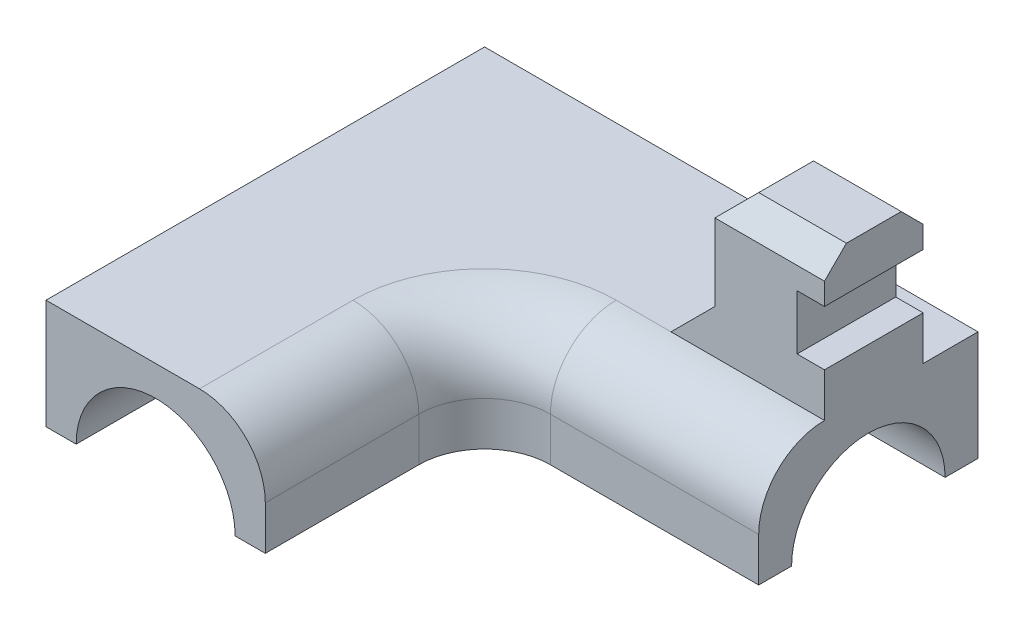
ISO-10303-21;
HEADER;
FILE_DESCRIPTION(('STEP AP214'),'2;1');
FILE_NAME('part.step','',(''),(''),'','','');
FILE_SCHEMA(('AUTOMOTIVE_DESIGN { 1 0 10303 214 1 1 1 1 }'));
ENDSEC;
DATA;
#1=APPLICATION_CONTEXT('core data for automotive mechanical design processes');
#2=APPLICATION_PROTOCOL_DEFINITION('international standard','automotive_design',2000,#1);
#3=PRODUCT_CONTEXT('',#1,'mechanical');
#4=PRODUCT('Part','Part','',(#3));
#5=PRODUCT_RELATED_PRODUCT_CATEGORY('part','',(#4));
#6=PRODUCT_DEFINITION_FORMATION('','',#4);
#7=PRODUCT_DEFINITION_CONTEXT('part definition',#1,'design');
#8=PRODUCT_DEFINITION('design','',#6,#7);
#9=PRODUCT_DEFINITION_SHAPE('','',#8);
#10=(LENGTH_UNIT() NAMED_UNIT(*) SI_UNIT(.MILLI.,.METRE.));
#11=(NAMED_UNIT(*) PLANE_ANGLE_UNIT() SI_UNIT($,.RADIAN.));
#12=(NAMED_UNIT(*) SI_UNIT($,.STERADIAN.) SOLID_ANGLE_UNIT());
#13=UNCERTAINTY_MEASURE_WITH_UNIT(LENGTH_MEASURE(1.E-05),#10,'distance_accuracy_value','');
#14=(GEOMETRIC_REPRESENTATION_CONTEXT(3) GLOBAL_UNCERTAINTY_ASSIGNED_CONTEXT((#13)) GLOBAL_UNIT_ASSIGNED_CONTEXT((#10,
#11,#12)) REPRESENTATION_CONTEXT('',''));
#15=CARTESIAN_POINT('',(0.,0.,0.));
#16=DIRECTION('',(0.,0.,1.));
#17=DIRECTION('',(1.,0.,0.));
#18=AXIS2_PLACEMENT_3D('',#15,#16,#17);
#19=CARTESIAN_POINT('',(0.,0.,0.));
#20=DIRECTION('',(0.,1.,0.));
#21=DIRECTION('',(0.,0.,1.));
#22=AXIS2_PLACEMENT_3D('',#19,#20,#21);
#23=PLANE('',#22);
#24=DIRECTION('',(0.,0.,1.));
#25=VECTOR('',#24,1.);
#26=CARTESIAN_POINT('',(15.,0.,10.));
#27=LINE('',#26,#25);
#28=CARTESIAN_POINT('',(15.,0.,16.));
#29=VERTEX_POINT('',#28);
#30=CARTESIAN_POINT('',(15.,0.,17.));
#31=VERTEX_POINT('',#30);
#32=EDGE_CURVE('E425',#29,#31,#27,.T.);
#33=ORIENTED_EDGE('',*,*,#32,.T.);
#34=DIRECTION('',(1.,0.,0.));
#35=VECTOR('',#34,1.);
#36=CARTESIAN_POINT('',(15.,0.,17.));
#37=LINE('',#36,#35);
#38=CARTESIAN_POINT('',(35.,0.,17.));
#39=VERTEX_POINT('',#38);
#40=EDGE_CURVE('E446',#39,#31,#37,.F.);
#41=ORIENTED_EDGE('',*,*,#40,.F.);
#42=DIRECTION('',(0.,0.,1.));
#43=VECTOR('',#42,1.);
#44=CARTESIAN_POINT('',(35.,0.,0.));
#45=LINE('',#44,#43);
#46=CARTESIAN_POINT('',(35.,0.,20.));
#47=VERTEX_POINT('',#46);
#48=EDGE_CURVE('E447',#39,#47,#45,.T.);
#49=ORIENTED_EDGE('',*,*,#48,.T.);
#50=DIRECTION('',(1.,0.,0.));
#51=VECTOR('',#50,1.);
#52=CARTESIAN_POINT('',(35.,0.,20.));
#53=LINE('',#52,#51);
#54=CARTESIAN_POINT('',(16.,0.,20.));
#55=VERTEX_POINT('',#54);
#56=EDGE_CURVE('E443',#55,#47,#53,.T.);
#57=ORIENTED_EDGE('',*,*,#56,.F.);
#58=CARTESIAN_POINT('',(16.,0.,26.));
#59=DIRECTION('',(0.,1.,0.));
#60=DIRECTION('',(0.,0.,1.));
#61=AXIS2_PLACEMENT_3D('',#58,#59,#60);
#62=CIRCLE('',#61,6.);
#63=CARTESIAN_POINT('',(10.,0.,26.));
#64=VERTEX_POINT('',#63);
#65=EDGE_CURVE('E422',#64,#55,#62,.F.);
#66=ORIENTED_EDGE('',*,*,#65,.F.);
#67=DIRECTION('',(0.,0.,-1.));
#68=VECTOR('',#67,1.);
#69=CARTESIAN_POINT('',(10.,0.,40.));
#70=LINE('',#69,#68);
#71=CARTESIAN_POINT('',(10.,0.,40.));
#72=VERTEX_POINT('',#71);
#73=EDGE_CURVE('E432',#72,#64,#70,.T.);
#74=ORIENTED_EDGE('',*,*,#73,.F.);
#75=DIRECTION('',(-1.,0.,0.));
#76=VECTOR('',#75,1.);
#77=CARTESIAN_POINT('',(0.,0.,40.));
#78=LINE('',#77,#76);
#79=CARTESIAN_POINT('',(7.25,0.,40.));
#80=VERTEX_POINT('',#79);
#81=EDGE_CURVE('E453',#72,#80,#78,.T.);
#82=ORIENTED_EDGE('',*,*,#81,.T.);
#83=DIRECTION('',(0.,0.,1.));
#84=VECTOR('',#83,1.);
#85=CARTESIAN_POINT('',(7.25,0.,20.));
#86=LINE('',#85,#84);
#87=CARTESIAN_POINT('',(7.25,0.,20.));
#88=VERTEX_POINT('',#87);
#89=EDGE_CURVE('E460',#88,#80,#86,.T.);
#90=ORIENTED_EDGE('',*,*,#89,.F.);
#91=DIRECTION('',(-1.,0.,0.));
#92=VECTOR('',#91,1.);
#93=CARTESIAN_POINT('',(0.,0.,20.));
#94=LINE('',#93,#92);
#95=CARTESIAN_POINT('',(6.,0.,20.));
#96=VERTEX_POINT('',#95);
#97=EDGE_CURVE('E429',#88,#96,#94,.T.);
#98=ORIENTED_EDGE('',*,*,#97,.T.);
#99=DIRECTION('',(0.,0.,1.));
#100=VECTOR('',#99,1.);
#101=CARTESIAN_POINT('',(6.,0.,-0.001000000000001));
#102=LINE('',#101,#100);
#103=CARTESIAN_POINT('',(6.,0.,16.));
#104=VERTEX_POINT('',#103);
#105=EDGE_CURVE('E41',#104,#96,#102,.T.);
#106=ORIENTED_EDGE('',*,*,#105,.F.);
#107=DIRECTION('',(1.,0.,0.));
#108=VECTOR('',#107,1.);
#109=CARTESIAN_POINT('',(-26.9705627484772,0.,16.));
#110=LINE('',#109,#108);
#111=EDGE_CURVE('E451',#29,#104,#110,.F.);
#112=ORIENTED_EDGE('',*,*,#111,.F.);
#113=EDGE_LOOP('',(#33,#41,#49,#57,#66,#74,#82,#90,#98,#106,#112));
#114=FACE_BOUND('',#113,.T.);
#115=ADVANCED_FACE('F37',(#114),#23,.F.);
#116=CARTESIAN_POINT('',(-6.,0.,20.));
#117=VERTEX_POINT('',#116);
#118=CARTESIAN_POINT('',(-7.25,0.,20.));
#119=VERTEX_POINT('',#118);
#120=EDGE_CURVE('E461',#117,#119,#94,.T.);
#121=ORIENTED_EDGE('',*,*,#120,.T.);
#122=DIRECTION('',(0.,0.,1.));
#123=VECTOR('',#122,1.);
#124=CARTESIAN_POINT('',(-7.25,0.,20.));
#125=LINE('',#124,#123);
#126=CARTESIAN_POINT('',(-7.25,0.,40.));
#127=VERTEX_POINT('',#126);
#128=EDGE_CURVE('E458',#127,#119,#125,.F.);
#129=ORIENTED_EDGE('',*,*,#128,.F.);
#130=CARTESIAN_POINT('',(-10.,0.,40.));
#131=VERTEX_POINT('',#130);
#132=EDGE_CURVE('E454',#127,#131,#78,.T.);
#133=ORIENTED_EDGE('',*,*,#132,.T.);
#134=DIRECTION('',(0.,0.,1.));
#135=VECTOR('',#134,1.);
#136=CARTESIAN_POINT('',(-10.,0.,40.));
#137=LINE('',#136,#135);
#138=CARTESIAN_POINT('',(-10.,0.,14.));
#139=VERTEX_POINT('',#138);
#140=EDGE_CURVE('E433',#139,#131,#137,.T.);
#141=ORIENTED_EDGE('',*,*,#140,.F.);
#142=CARTESIAN_POINT('',(-10.,0.,15.));
#143=DIRECTION('',(0.,1.,0.));
#144=DIRECTION('',(0.,0.,1.));
#145=AXIS2_PLACEMENT_3D('',#142,#143,#144);
#146=CIRCLE('',#145,1.);
#147=CARTESIAN_POINT('',(-9.,0.,15.));
#148=VERTEX_POINT('',#147);
#149=EDGE_CURVE('E46',#139,#148,#146,.F.);
#150=ORIENTED_EDGE('',*,*,#149,.T.);
#151=DIRECTION('',(0.,0.,1.));
#152=VECTOR('',#151,1.);
#153=CARTESIAN_POINT('',(-9.,0.,40.));
#154=LINE('',#153,#152);
#155=CARTESIAN_POINT('',(-9.,0.,16.));
#156=VERTEX_POINT('',#155);
#157=EDGE_CURVE('E426',#148,#156,#154,.T.);
#158=ORIENTED_EDGE('',*,*,#157,.T.);
#159=CARTESIAN_POINT('',(-6.,0.,16.));
#160=VERTEX_POINT('',#159);
#161=EDGE_CURVE('E436',#160,#156,#110,.F.);
#162=ORIENTED_EDGE('',*,*,#161,.F.);
#163=DIRECTION('',(0.,0.,1.));
#164=VECTOR('',#163,1.);
#165=CARTESIAN_POINT('',(-6.,0.,-0.001000000000001));
#166=LINE('',#165,#164);
#167=EDGE_CURVE('E437',#117,#160,#166,.F.);
#168=ORIENTED_EDGE('',*,*,#167,.F.);
#169=EDGE_LOOP('',(#121,#129,#133,#141,#150,#158,#162,#168));
#170=FACE_BOUND('',#169,.T.);
#171=ADVANCED_FACE('F483',(#170),#23,.F.);
#172=CARTESIAN_POINT('',(35.,0.,0.));
#173=VERTEX_POINT('',#172);
#174=CARTESIAN_POINT('',(35.,0.,3.));
#175=VERTEX_POINT('',#174);
#176=EDGE_CURVE('E450',#173,#175,#45,.T.);
#177=ORIENTED_EDGE('',*,*,#176,.T.);
#178=DIRECTION('',(1.,0.,0.));
#179=VECTOR('',#178,1.);
#180=CARTESIAN_POINT('',(15.,0.,3.));
#181=LINE('',#180,#179);
#182=CARTESIAN_POINT('',(15.,0.,3.));
#183=VERTEX_POINT('',#182);
#184=EDGE_CURVE('E444',#183,#175,#181,.T.);
#185=ORIENTED_EDGE('',*,*,#184,.F.);
#186=CARTESIAN_POINT('',(15.,0.,4.));
#187=VERTEX_POINT('',#186);
#188=EDGE_CURVE('E440',#183,#187,#27,.T.);
#189=ORIENTED_EDGE('',*,*,#188,.T.);
#190=DIRECTION('',(1.,0.,0.));
#191=VECTOR('',#190,1.);
#192=CARTESIAN_POINT('',(-26.9705627484772,0.,4.));
#193=LINE('',#192,#191);
#194=CARTESIAN_POINT('',(-9.,0.,4.));
#195=VERTEX_POINT('',#194);
#196=EDGE_CURVE('E434',#195,#187,#193,.T.);
#197=ORIENTED_EDGE('',*,*,#196,.F.);
#198=CARTESIAN_POINT('',(-9.,0.,5.));
#199=VERTEX_POINT('',#198);
#200=EDGE_CURVE('E430',#195,#199,#154,.T.);
#201=ORIENTED_EDGE('',*,*,#200,.T.);
#202=CARTESIAN_POINT('',(-10.,0.,5.));
#203=DIRECTION('',(0.,1.,0.));
#204=DIRECTION('',(0.,0.,1.));
#205=AXIS2_PLACEMENT_3D('',#202,#203,#204);
#206=CIRCLE('',#205,1.);
#207=CARTESIAN_POINT('',(-10.,0.,6.));
#208=VERTEX_POINT('',#207);
#209=EDGE_CURVE('E12',#199,#208,#206,.F.);
#210=ORIENTED_EDGE('',*,*,#209,.T.);
#211=CARTESIAN_POINT('',(-10.,0.,0.));
#212=VERTEX_POINT('',#211);
#213=EDGE_CURVE('E61',#212,#208,#137,.T.);
#214=ORIENTED_EDGE('',*,*,#213,.F.);
#215=DIRECTION('',(-1.,0.,0.));
#216=VECTOR('',#215,1.);
#217=CARTESIAN_POINT('',(0.,0.,0.));
#218=LINE('',#217,#216);
#219=EDGE_CURVE('E441',#173,#212,#218,.T.);
#220=ORIENTED_EDGE('',*,*,#219,.F.);
#221=EDGE_LOOP('',(#177,#185,#189,#197,#201,#210,#214,#220));
#222=FACE_BOUND('',#221,.T.);
#223=ADVANCED_FACE('F39',(#222),#23,.F.);
#224=CARTESIAN_POINT('',(-10.,10.,40.));
#225=DIRECTION('',(0.,-1.,0.));
#226=DIRECTION('',(0.,0.,-1.));
#227=AXIS2_PLACEMENT_3D('',#224,#225,#226);
#228=PLANE('',#227);
#229=DIRECTION('',(-1.,0.,0.));
#230=VECTOR('',#229,1.);
#231=CARTESIAN_POINT('',(-10.,10.,40.));
#232=LINE('',#231,#230);
#233=CARTESIAN_POINT('',(4.,10.,40.));
#234=VERTEX_POINT('',#233);
#235=CARTESIAN_POINT('',(-10.,10.,40.));
#236=VERTEX_POINT('',#235);
#237=EDGE_CURVE('E360',#234,#236,#232,.T.);
#238=ORIENTED_EDGE('',*,*,#237,.F.);
#239=DIRECTION('',(0.,0.,-1.));
#240=VECTOR('',#239,1.);
#241=CARTESIAN_POINT('',(4.,10.,40.));
#242=LINE('',#241,#240);
#243=CARTESIAN_POINT('',(4.,10.,26.));
#244=VERTEX_POINT('',#243);
#245=EDGE_CURVE('E408',#234,#244,#242,.T.);
#246=ORIENTED_EDGE('',*,*,#245,.T.);
#247=CARTESIAN_POINT('',(16.,10.,26.));
#248=DIRECTION('',(0.,-1.,0.));
#249=DIRECTION('',(0.,0.,-1.));
#250=AXIS2_PLACEMENT_3D('',#247,#248,#249);
#251=CIRCLE('',#250,12.);
#252=CARTESIAN_POINT('',(16.,10.,14.));
#253=VERTEX_POINT('',#252);
#254=EDGE_CURVE('E245',#253,#244,#251,.F.);
#255=ORIENTED_EDGE('',*,*,#254,.F.);
#256=DIRECTION('',(-1.,0.,0.));
#257=VECTOR('',#256,1.);
#258=CARTESIAN_POINT('',(-10.,10.,14.));
#259=LINE('',#258,#257);
#260=CARTESIAN_POINT('',(20.9999999999999,10.,14.));
#261=VERTEX_POINT('',#260);
#262=EDGE_CURVE('E238',#253,#261,#259,.F.);
#263=ORIENTED_EDGE('',*,*,#262,.T.);
#264=DIRECTION('',(0.,0.,-1.));
#265=VECTOR('',#264,1.);
#266=CARTESIAN_POINT('',(20.9999999999999,10.,14.));
#267=LINE('',#266,#265);
#268=CARTESIAN_POINT('',(20.9999999999999,10.,5.));
#269=VERTEX_POINT('',#268);
#270=EDGE_CURVE('E243',#261,#269,#267,.T.);
#271=ORIENTED_EDGE('',*,*,#270,.T.);
#272=DIRECTION('',(-1.,0.,0.));
#273=VECTOR('',#272,1.);
#274=CARTESIAN_POINT('',(20.9999999999999,10.,5.));
#275=LINE('',#274,#273);
#276=CARTESIAN_POINT('',(35.,10.,5.));
#277=VERTEX_POINT('',#276);
#278=EDGE_CURVE('E295',#277,#269,#275,.T.);
#279=ORIENTED_EDGE('',*,*,#278,.F.);
#280=DIRECTION('',(0.,0.,1.));
#281=VECTOR('',#280,1.);
#282=CARTESIAN_POINT('',(35.,10.,20.));
#283=LINE('',#282,#281);
#284=CARTESIAN_POINT('',(35.,10.,0.));
#285=VERTEX_POINT('',#284);
#286=EDGE_CURVE('E351',#285,#277,#283,.T.);
#287=ORIENTED_EDGE('',*,*,#286,.F.);
#288=DIRECTION('',(-1.,0.,0.));
#289=VECTOR('',#288,1.);
#290=CARTESIAN_POINT('',(-10.,10.,0.));
#291=LINE('',#290,#289);
#292=CARTESIAN_POINT('',(-10.,10.,0.));
#293=VERTEX_POINT('',#292);
#294=EDGE_CURVE('E357',#285,#293,#291,.T.);
#295=ORIENTED_EDGE('',*,*,#294,.T.);
#296=DIRECTION('',(0.,0.,-1.));
#297=VECTOR('',#296,1.);
#298=CARTESIAN_POINT('',(-10.,10.,40.));
#299=LINE('',#298,#297);
#300=EDGE_CURVE('E366',#236,#293,#299,.T.);
#301=ORIENTED_EDGE('',*,*,#300,.F.);
#302=EDGE_LOOP('',(#238,#246,#255,#263,#271,#279,#287,#295,#301));
#303=FACE_BOUND('',#302,.T.);
#304=ADVANCED_FACE('F241',(#303),#228,.F.);
#305=CARTESIAN_POINT('',(-26.9705627484772,0.,10.));
#306=DIRECTION('',(1.,0.,0.));
#307=DIRECTION('',(0.,1.,0.));
#308=AXIS2_PLACEMENT_3D('',#305,#306,#307);
#309=CYLINDRICAL_SURFACE('',#308,6.);
#310=CARTESIAN_POINT('',(15.,0.,10.));
#311=DIRECTION('',(1.,0.,0.));
#312=DIRECTION('',(0.,1.,0.));
#313=AXIS2_PLACEMENT_3D('',#310,#311,#312);
#314=CIRCLE('',#313,6.);
#315=EDGE_CURVE('E331',#29,#187,#314,.F.);
#316=ORIENTED_EDGE('',*,*,#315,.F.);
#317=ORIENTED_EDGE('',*,*,#111,.T.);
#318=CARTESIAN_POINT('',(0.,0.,10.));
#319=DIRECTION('',(-0.707106781186547,0.,0.707106781186548));
#320=DIRECTION('',(0.707106781186547,0.,0.707106781186548));
#321=AXIS2_PLACEMENT_3D('',#318,#319,#320);
#322=ELLIPSE('',#321,8.48528137423857,6.);
#323=CARTESIAN_POINT('',(0.,6.,10.));
#324=VERTEX_POINT('',#323);
#325=EDGE_CURVE('E344',#324,#104,#322,.F.);
#326=ORIENTED_EDGE('',*,*,#325,.F.);
#327=CARTESIAN_POINT('',(0.,0.,10.));
#328=DIRECTION('',(0.707106781186547,0.,0.707106781186548));
#329=DIRECTION('',(-0.707106781186547,0.,0.707106781186548));
#330=AXIS2_PLACEMENT_3D('',#327,#328,#329);
#331=ELLIPSE('',#330,8.48528137423857,6.);
#332=EDGE_CURVE('E341',#160,#324,#331,.F.);
#333=ORIENTED_EDGE('',*,*,#332,.F.);
#334=ORIENTED_EDGE('',*,*,#161,.T.);
#335=CARTESIAN_POINT('',(-9.,0.,10.));
#336=DIRECTION('',(1.,0.,0.));
#337=DIRECTION('',(0.,1.,0.));
#338=AXIS2_PLACEMENT_3D('',#335,#336,#337);
#339=CIRCLE('',#338,6.);
#340=EDGE_CURVE('E343',#156,#195,#339,.F.);
#341=ORIENTED_EDGE('',*,*,#340,.T.);
#342=ORIENTED_EDGE('',*,*,#196,.T.);
#343=EDGE_LOOP('',(#316,#317,#326,#333,#334,#341,#342));
#344=FACE_BOUND('',#343,.T.);
#345=ADVANCED_FACE('F497',(#344),#309,.F.);
#346=CARTESIAN_POINT('',(0.,0.,-0.001000000000001));
#347=DIRECTION('',(0.,0.,1.));
#348=DIRECTION('',(1.,0.,0.));
#349=AXIS2_PLACEMENT_3D('',#346,#347,#348);
#350=CYLINDRICAL_SURFACE('',#349,6.);
#351=CARTESIAN_POINT('',(0.,0.,20.));
#352=DIRECTION('',(0.,0.,1.));
#353=DIRECTION('',(1.,0.,0.));
#354=AXIS2_PLACEMENT_3D('',#351,#352,#353);
#355=CIRCLE('',#354,6.);
#356=EDGE_CURVE('E337',#117,#96,#355,.F.);
#357=ORIENTED_EDGE('',*,*,#356,.F.);
#358=ORIENTED_EDGE('',*,*,#167,.T.);
#359=ORIENTED_EDGE('',*,*,#332,.T.);
#360=ORIENTED_EDGE('',*,*,#325,.T.);
#361=ORIENTED_EDGE('',*,*,#105,.T.);
#362=EDGE_LOOP('',(#357,#358,#359,#360,#361));
#363=FACE_BOUND('',#362,.T.);
#364=ADVANCED_FACE('F493',(#363),#350,.F.);
#365=CARTESIAN_POINT('',(10.,10.,40.));
#366=DIRECTION('',(-1.,0.,0.));
#367=DIRECTION('',(0.,-1.,0.));
#368=AXIS2_PLACEMENT_3D('',#365,#366,#367);
#369=PLANE('',#368);
#370=DIRECTION('',(0.,1.,0.));
#371=VECTOR('',#370,1.);
#372=CARTESIAN_POINT('',(10.,10.,40.));
#373=LINE('',#372,#371);
#374=CARTESIAN_POINT('',(10.,4.,40.));
#375=VERTEX_POINT('',#374);
#376=EDGE_CURVE('E358',#72,#375,#373,.T.);
#377=ORIENTED_EDGE('',*,*,#376,.F.);
#378=ORIENTED_EDGE('',*,*,#73,.T.);
#379=DIRECTION('',(0.,-1.,0.));
#380=VECTOR('',#379,1.);
#381=CARTESIAN_POINT('',(10.,9.99999999999999,26.));
#382=LINE('',#381,#380);
#383=CARTESIAN_POINT('',(10.,4.,26.));
#384=VERTEX_POINT('',#383);
#385=EDGE_CURVE('E403',#64,#384,#382,.F.);
#386=ORIENTED_EDGE('',*,*,#385,.T.);
#387=DIRECTION('',(0.,0.,-1.));
#388=VECTOR('',#387,1.);
#389=CARTESIAN_POINT('',(10.,4.,40.));
#390=LINE('',#389,#388);
#391=EDGE_CURVE('E250',#384,#375,#390,.F.);
#392=ORIENTED_EDGE('',*,*,#391,.T.);
#393=EDGE_LOOP('',(#377,#378,#386,#392));
#394=FACE_BOUND('',#393,.T.);
#395=ADVANCED_FACE('F527',(#394),#369,.F.);
#396=CARTESIAN_POINT('',(-10.,10.,40.));
#397=DIRECTION('',(1.,0.,0.));
#398=DIRECTION('',(0.,1.,0.));
#399=AXIS2_PLACEMENT_3D('',#396,#397,#398);
#400=PLANE('',#399);
#401=DIRECTION('',(0.,-1.,0.));
#402=VECTOR('',#401,1.);
#403=CARTESIAN_POINT('',(-10.,10.,0.));
#404=LINE('',#403,#402);
#405=EDGE_CURVE('E361',#293,#212,#404,.T.);
#406=ORIENTED_EDGE('',*,*,#405,.T.);
#407=ORIENTED_EDGE('',*,*,#213,.T.);
#408=CARTESIAN_POINT('',(-10.,0.,10.));
#409=DIRECTION('',(-1.,0.,0.));
#410=DIRECTION('',(0.,-1.,0.));
#411=AXIS2_PLACEMENT_3D('',#408,#409,#410);
#412=CIRCLE('',#411,4.);
#413=EDGE_CURVE('E314',#139,#208,#412,.T.);
#414=ORIENTED_EDGE('',*,*,#413,.F.);
#415=ORIENTED_EDGE('',*,*,#140,.T.);
#416=DIRECTION('',(0.,-1.,0.));
#417=VECTOR('',#416,1.);
#418=CARTESIAN_POINT('',(-10.,10.,40.));
#419=LINE('',#418,#417);
#420=EDGE_CURVE('E363',#236,#131,#419,.T.);
#421=ORIENTED_EDGE('',*,*,#420,.F.);
#422=ORIENTED_EDGE('',*,*,#300,.T.);
#423=EDGE_LOOP('',(#406,#407,#414,#415,#421,#422));
#424=FACE_BOUND('',#423,.T.);
#425=ADVANCED_FACE('F536',(#424),#400,.F.);
#426=CARTESIAN_POINT('',(0.,0.,40.));
#427=DIRECTION('',(0.,0.,1.));
#428=DIRECTION('',(1.,0.,0.));
#429=AXIS2_PLACEMENT_3D('',#426,#427,#428);
#430=PLANE('',#429);
#431=ORIENTED_EDGE('',*,*,#81,.F.);
#432=ORIENTED_EDGE('',*,*,#376,.T.);
#433=CARTESIAN_POINT('',(4.,4.,40.));
#434=DIRECTION('',(0.,0.,1.));
#435=DIRECTION('',(1.,0.,0.));
#436=AXIS2_PLACEMENT_3D('',#433,#434,#435);
#437=CIRCLE('',#436,6.);
#438=EDGE_CURVE('E410',#375,#234,#437,.T.);
#439=ORIENTED_EDGE('',*,*,#438,.T.);
#440=ORIENTED_EDGE('',*,*,#237,.T.);
#441=ORIENTED_EDGE('',*,*,#420,.T.);
#442=ORIENTED_EDGE('',*,*,#132,.F.);
#443=CARTESIAN_POINT('',(0.,0.,40.));
#444=DIRECTION('',(0.,0.,1.));
#445=DIRECTION('',(1.,0.,0.));
#446=AXIS2_PLACEMENT_3D('',#443,#444,#445);
#447=CIRCLE('',#446,7.25);
#448=EDGE_CURVE('E338',#80,#127,#447,.T.);
#449=ORIENTED_EDGE('',*,*,#448,.F.);
#450=EDGE_LOOP('',(#431,#432,#439,#440,#441,#442,#449));
#451=FACE_BOUND('',#450,.T.);
#452=ADVANCED_FACE('F479',(#451),#430,.T.);
#453=CARTESIAN_POINT('',(0.,0.,0.));
#454=DIRECTION('',(0.,0.,1.));
#455=DIRECTION('',(1.,0.,0.));
#456=AXIS2_PLACEMENT_3D('',#453,#454,#455);
#457=PLANE('',#456);
#458=DIRECTION('',(0.,1.,0.));
#459=VECTOR('',#458,1.);
#460=CARTESIAN_POINT('',(35.,10.,0.));
#461=LINE('',#460,#459);
#462=EDGE_CURVE('E349',#173,#285,#461,.T.);
#463=ORIENTED_EDGE('',*,*,#462,.F.);
#464=ORIENTED_EDGE('',*,*,#219,.T.);
#465=ORIENTED_EDGE('',*,*,#405,.F.);
#466=ORIENTED_EDGE('',*,*,#294,.F.);
#467=EDGE_LOOP('',(#463,#464,#465,#466));
#468=FACE_BOUND('',#467,.T.);
#469=ADVANCED_FACE('F544',(#468),#457,.F.);
#470=CARTESIAN_POINT('',(35.,10.,20.));
#471=DIRECTION('',(0.,0.,-1.));
#472=DIRECTION('',(0.,1.,0.));
#473=AXIS2_PLACEMENT_3D('',#470,#471,#472);
#474=PLANE('',#473);
#475=DIRECTION('',(0.,-1.,0.));
#476=VECTOR('',#475,1.);
#477=CARTESIAN_POINT('',(16.,-10.,20.));
#478=LINE('',#477,#476);
#479=CARTESIAN_POINT('',(16.,4.,20.));
#480=VERTEX_POINT('',#479);
#481=EDGE_CURVE('E400',#480,#55,#478,.T.);
#482=ORIENTED_EDGE('',*,*,#481,.T.);
#483=ORIENTED_EDGE('',*,*,#56,.T.);
#484=DIRECTION('',(0.,-1.,0.));
#485=VECTOR('',#484,1.);
#486=CARTESIAN_POINT('',(35.,10.,20.));
#487=LINE('',#486,#485);
#488=CARTESIAN_POINT('',(35.,4.,20.));
#489=VERTEX_POINT('',#488);
#490=EDGE_CURVE('E354',#489,#47,#487,.T.);
#491=ORIENTED_EDGE('',*,*,#490,.F.);
#492=DIRECTION('',(-1.,0.,0.));
#493=VECTOR('',#492,1.);
#494=CARTESIAN_POINT('',(35.,4.,20.));
#495=LINE('',#494,#493);
#496=EDGE_CURVE('E392',#489,#480,#495,.T.);
#497=ORIENTED_EDGE('',*,*,#496,.T.);
#498=EDGE_LOOP('',(#482,#483,#491,#497));
#499=FACE_BOUND('',#498,.T.);
#500=ADVANCED_FACE('F516',(#499),#474,.F.);
#501=CARTESIAN_POINT('',(35.,0.,0.));
#502=DIRECTION('',(1.,0.,0.));
#503=DIRECTION('',(0.,1.,0.));
#504=AXIS2_PLACEMENT_3D('',#501,#502,#503);
#505=PLANE('',#504);
#506=ORIENTED_EDGE('',*,*,#176,.F.);
#507=ORIENTED_EDGE('',*,*,#462,.T.);
#508=ORIENTED_EDGE('',*,*,#286,.T.);
#509=DIRECTION('',(0.,-1.,0.));
#510=VECTOR('',#509,1.);
#511=CARTESIAN_POINT('',(35.,10.,5.));
#512=LINE('',#511,#510);
#513=CARTESIAN_POINT('',(35.,14.,5.));
#514=VERTEX_POINT('',#513);
#515=EDGE_CURVE('E277',#514,#277,#512,.T.);
#516=ORIENTED_EDGE('',*,*,#515,.F.);
#517=DIRECTION('',(0.,0.,-1.));
#518=VECTOR('',#517,1.);
#519=CARTESIAN_POINT('',(35.,14.,14.));
#520=LINE('',#519,#518);
#521=CARTESIAN_POINT('',(35.,14.,14.));
#522=VERTEX_POINT('',#521);
#523=EDGE_CURVE('E312',#522,#514,#520,.T.);
#524=ORIENTED_EDGE('',*,*,#523,.F.);
#525=DIRECTION('',(0.,-1.,0.));
#526=VECTOR('',#525,1.);
#527=CARTESIAN_POINT('',(35.,10.,14.));
#528=LINE('',#527,#526);
#529=CARTESIAN_POINT('',(35.,10.,14.));
#530=VERTEX_POINT('',#529);
#531=EDGE_CURVE('E261',#522,#530,#528,.T.);
#532=ORIENTED_EDGE('',*,*,#531,.T.);
#533=CARTESIAN_POINT('',(35.,4.,14.));
#534=DIRECTION('',(1.,0.,0.));
#535=DIRECTION('',(0.,1.,0.));
#536=AXIS2_PLACEMENT_3D('',#533,#534,#535);
#537=CIRCLE('',#536,6.);
#538=EDGE_CURVE('E276',#530,#489,#537,.T.);
#539=ORIENTED_EDGE('',*,*,#538,.T.);
#540=ORIENTED_EDGE('',*,*,#490,.T.);
#541=ORIENTED_EDGE('',*,*,#48,.F.);
#542=CARTESIAN_POINT('',(35.,0.,10.));
#543=DIRECTION('',(1.,0.,0.));
#544=DIRECTION('',(0.,1.,0.));
#545=AXIS2_PLACEMENT_3D('',#542,#543,#544);
#546=CIRCLE('',#545,7.);
#547=EDGE_CURVE('E327',#175,#39,#546,.T.);
#548=ORIENTED_EDGE('',*,*,#547,.F.);
#549=EDGE_LOOP('',(#506,#507,#508,#516,#524,#532,#539,#540,#541,#548));
#550=FACE_BOUND('',#549,.T.);
#551=ADVANCED_FACE('F512',(#550),#505,.T.);
#552=CARTESIAN_POINT('',(-9.,10.,40.));
#553=DIRECTION('',(1.,0.,0.));
#554=DIRECTION('',(0.,1.,0.));
#555=AXIS2_PLACEMENT_3D('',#552,#553,#554);
#556=PLANE('',#555);
#557=ORIENTED_EDGE('',*,*,#200,.F.);
#558=ORIENTED_EDGE('',*,*,#340,.F.);
#559=ORIENTED_EDGE('',*,*,#157,.F.);
#560=CARTESIAN_POINT('',(-9.,0.,10.));
#561=DIRECTION('',(1.,0.,0.));
#562=DIRECTION('',(0.,1.,0.));
#563=AXIS2_PLACEMENT_3D('',#560,#561,#562);
#564=CIRCLE('',#563,5.);
#565=EDGE_CURVE('E413',#148,#199,#564,.F.);
#566=ORIENTED_EDGE('',*,*,#565,.T.);
#567=EDGE_LOOP('',(#557,#558,#559,#566));
#568=FACE_BOUND('',#567,.T.);
#569=ADVANCED_FACE('F541',(#568),#556,.T.);
#570=CARTESIAN_POINT('',(0.,0.,20.));
#571=DIRECTION('',(0.,0.,1.));
#572=DIRECTION('',(1.,0.,0.));
#573=AXIS2_PLACEMENT_3D('',#570,#571,#572);
#574=PLANE('',#573);
#575=ORIENTED_EDGE('',*,*,#97,.F.);
#576=CARTESIAN_POINT('',(0.,0.,20.));
#577=DIRECTION('',(0.,0.,1.));
#578=DIRECTION('',(1.,0.,0.));
#579=AXIS2_PLACEMENT_3D('',#576,#577,#578);
#580=CIRCLE('',#579,7.25);
#581=EDGE_CURVE('E334',#88,#119,#580,.T.);
#582=ORIENTED_EDGE('',*,*,#581,.T.);
#583=ORIENTED_EDGE('',*,*,#120,.F.);
#584=ORIENTED_EDGE('',*,*,#356,.T.);
#585=EDGE_LOOP('',(#575,#582,#583,#584));
#586=FACE_BOUND('',#585,.T.);
#587=ADVANCED_FACE('F488',(#586),#574,.T.);
#588=CARTESIAN_POINT('',(0.,0.,20.));
#589=DIRECTION('',(0.,0.,1.));
#590=DIRECTION('',(1.,0.,0.));
#591=AXIS2_PLACEMENT_3D('',#588,#589,#590);
#592=CYLINDRICAL_SURFACE('',#591,7.25);
#593=ORIENTED_EDGE('',*,*,#448,.T.);
#594=ORIENTED_EDGE('',*,*,#128,.T.);
#595=ORIENTED_EDGE('',*,*,#581,.F.);
#596=ORIENTED_EDGE('',*,*,#89,.T.);
#597=EDGE_LOOP('',(#593,#594,#595,#596));
#598=FACE_BOUND('',#597,.T.);
#599=ADVANCED_FACE('F471',(#598),#592,.F.);
#600=CARTESIAN_POINT('',(15.,0.,10.));
#601=DIRECTION('',(1.,0.,0.));
#602=DIRECTION('',(0.,1.,0.));
#603=AXIS2_PLACEMENT_3D('',#600,#601,#602);
#604=PLANE('',#603);
#605=ORIENTED_EDGE('',*,*,#188,.F.);
#606=CARTESIAN_POINT('',(15.,0.,10.));
#607=DIRECTION('',(1.,0.,0.));
#608=DIRECTION('',(0.,1.,0.));
#609=AXIS2_PLACEMENT_3D('',#606,#607,#608);
#610=CIRCLE('',#609,7.);
#611=EDGE_CURVE('E328',#183,#31,#610,.T.);
#612=ORIENTED_EDGE('',*,*,#611,.T.);
#613=ORIENTED_EDGE('',*,*,#32,.F.);
#614=ORIENTED_EDGE('',*,*,#315,.T.);
#615=EDGE_LOOP('',(#605,#612,#613,#614));
#616=FACE_BOUND('',#615,.T.);
#617=ADVANCED_FACE('F501',(#616),#604,.T.);
#618=CARTESIAN_POINT('',(15.,0.,10.));
#619=DIRECTION('',(1.,0.,0.));
#620=DIRECTION('',(0.,1.,0.));
#621=AXIS2_PLACEMENT_3D('',#618,#619,#620);
#622=CYLINDRICAL_SURFACE('',#621,7.);
#623=ORIENTED_EDGE('',*,*,#547,.T.);
#624=ORIENTED_EDGE('',*,*,#40,.T.);
#625=ORIENTED_EDGE('',*,*,#611,.F.);
#626=ORIENTED_EDGE('',*,*,#184,.T.);
#627=EDGE_LOOP('',(#623,#624,#625,#626));
#628=FACE_BOUND('',#627,.T.);
#629=ADVANCED_FACE('F508',(#628),#622,.F.);
#630=CARTESIAN_POINT('',(35.,14.,14.));
#631=DIRECTION('',(0.,1.,0.));
#632=DIRECTION('',(0.,0.,1.));
#633=AXIS2_PLACEMENT_3D('',#630,#631,#632);
#634=PLANE('',#633);
#635=DIRECTION('',(1.,0.,0.));
#636=VECTOR('',#635,1.);
#637=CARTESIAN_POINT('',(35.,14.,5.));
#638=LINE('',#637,#636);
#639=CARTESIAN_POINT('',(32.5,14.,5.));
#640=VERTEX_POINT('',#639);
#641=EDGE_CURVE('E279',#640,#514,#638,.T.);
#642=ORIENTED_EDGE('',*,*,#641,.F.);
#643=DIRECTION('',(0.,0.,-1.));
#644=VECTOR('',#643,1.);
#645=CARTESIAN_POINT('',(32.5,14.,14.));
#646=LINE('',#645,#644);
#647=CARTESIAN_POINT('',(32.5,14.,14.));
#648=VERTEX_POINT('',#647);
#649=EDGE_CURVE('E315',#648,#640,#646,.T.);
#650=ORIENTED_EDGE('',*,*,#649,.F.);
#651=DIRECTION('',(1.,0.,0.));
#652=VECTOR('',#651,1.);
#653=CARTESIAN_POINT('',(35.,14.,14.));
#654=LINE('',#653,#652);
#655=EDGE_CURVE('E291',#648,#522,#654,.T.);
#656=ORIENTED_EDGE('',*,*,#655,.T.);
#657=ORIENTED_EDGE('',*,*,#523,.T.);
#658=EDGE_LOOP('',(#642,#650,#656,#657));
#659=FACE_BOUND('',#658,.T.);
#660=ADVANCED_FACE('F551',(#659),#634,.T.);
#661=CARTESIAN_POINT('',(32.5,14.,14.));
#662=DIRECTION('',(1.,0.,0.));
#663=DIRECTION('',(0.,0.,-1.));
#664=AXIS2_PLACEMENT_3D('',#661,#662,#663);
#665=PLANE('',#664);
#666=DIRECTION('',(0.,-1.,0.));
#667=VECTOR('',#666,1.);
#668=CARTESIAN_POINT('',(32.5,14.,5.));
#669=LINE('',#668,#667);
#670=CARTESIAN_POINT('',(32.5,19.,5.));
#671=VERTEX_POINT('',#670);
#672=EDGE_CURVE('E307',#671,#640,#669,.T.);
#673=ORIENTED_EDGE('',*,*,#672,.F.);
#674=DIRECTION('',(0.,0.,-1.));
#675=VECTOR('',#674,1.);
#676=CARTESIAN_POINT('',(32.5,19.,14.));
#677=LINE('',#676,#675);
#678=CARTESIAN_POINT('',(32.5,19.,14.));
#679=VERTEX_POINT('',#678);
#680=EDGE_CURVE('E317',#679,#671,#677,.T.);
#681=ORIENTED_EDGE('',*,*,#680,.F.);
#682=DIRECTION('',(0.,-1.,0.));
#683=VECTOR('',#682,1.);
#684=CARTESIAN_POINT('',(32.5,14.,14.));
#685=LINE('',#684,#683);
#686=EDGE_CURVE('E288',#679,#648,#685,.T.);
#687=ORIENTED_EDGE('',*,*,#686,.T.);
#688=ORIENTED_EDGE('',*,*,#649,.T.);
#689=EDGE_LOOP('',(#673,#681,#687,#688));
#690=FACE_BOUND('',#689,.T.);
#691=ADVANCED_FACE('F556',(#690),#665,.T.);
#692=CARTESIAN_POINT('',(32.5,19.,14.));
#693=DIRECTION('',(0.,-1.,0.));
#694=DIRECTION('',(1.,0.,0.));
#695=AXIS2_PLACEMENT_3D('',#692,#693,#694);
#696=PLANE('',#695);
#697=DIRECTION('',(-1.,0.,0.));
#698=VECTOR('',#697,1.);
#699=CARTESIAN_POINT('',(32.5,19.,5.));
#700=LINE('',#699,#698);
#701=CARTESIAN_POINT('',(35.,19.,5.));
#702=VERTEX_POINT('',#701);
#703=EDGE_CURVE('E304',#702,#671,#700,.T.);
#704=ORIENTED_EDGE('',*,*,#703,.F.);
#705=DIRECTION('',(0.,0.,-1.));
#706=VECTOR('',#705,1.);
#707=CARTESIAN_POINT('',(35.,19.,14.));
#708=LINE('',#707,#706);
#709=CARTESIAN_POINT('',(35.,19.,14.));
#710=VERTEX_POINT('',#709);
#711=EDGE_CURVE('E319',#710,#702,#708,.T.);
#712=ORIENTED_EDGE('',*,*,#711,.F.);
#713=DIRECTION('',(-1.,0.,0.));
#714=VECTOR('',#713,1.);
#715=CARTESIAN_POINT('',(32.5,19.,14.));
#716=LINE('',#715,#714);
#717=EDGE_CURVE('E285',#710,#679,#716,.T.);
#718=ORIENTED_EDGE('',*,*,#717,.T.);
#719=ORIENTED_EDGE('',*,*,#680,.T.);
#720=EDGE_LOOP('',(#704,#712,#718,#719));
#721=FACE_BOUND('',#720,.T.);
#722=ADVANCED_FACE('F559',(#721),#696,.T.);
#723=CARTESIAN_POINT('',(35.,19.,14.));
#724=DIRECTION('',(1.,0.,0.));
#725=DIRECTION('',(0.,0.,-1.));
#726=AXIS2_PLACEMENT_3D('',#723,#724,#725);
#727=PLANE('',#726);
#728=DIRECTION('',(0.,-1.,0.));
#729=VECTOR('',#728,1.);
#730=CARTESIAN_POINT('',(35.,19.,5.));
#731=LINE('',#730,#729);
#732=CARTESIAN_POINT('',(35.,21.,5.));
#733=VERTEX_POINT('',#732);
#734=EDGE_CURVE('E302',#733,#702,#731,.T.);
#735=ORIENTED_EDGE('',*,*,#734,.F.);
#736=DIRECTION('',(0.,0.707106781186546,0.707106781186549));
#737=VECTOR('',#736,1.);
#738=CARTESIAN_POINT('',(35.,24.5,8.50000000000001));
#739=LINE('',#738,#737);
#740=CARTESIAN_POINT('',(35.,23.,7.));
#741=VERTEX_POINT('',#740);
#742=EDGE_CURVE('E380',#733,#741,#739,.T.);
#743=ORIENTED_EDGE('',*,*,#742,.T.);
#744=DIRECTION('',(0.,0.,-1.));
#745=VECTOR('',#744,1.);
#746=CARTESIAN_POINT('',(35.,23.,14.));
#747=LINE('',#746,#745);
#748=CARTESIAN_POINT('',(35.,23.,12.));
#749=VERTEX_POINT('',#748);
#750=EDGE_CURVE('E322',#749,#741,#747,.T.);
#751=ORIENTED_EDGE('',*,*,#750,.F.);
#752=DIRECTION('',(0.,0.707106781186546,-0.707106781186549));
#753=VECTOR('',#752,1.);
#754=CARTESIAN_POINT('',(35.,20.,15.));
#755=LINE('',#754,#753);
#756=CARTESIAN_POINT('',(35.,21.,14.));
#757=VERTEX_POINT('',#756);
#758=EDGE_CURVE('E378',#749,#757,#755,.F.);
#759=ORIENTED_EDGE('',*,*,#758,.T.);
#760=DIRECTION('',(0.,-1.,0.));
#761=VECTOR('',#760,1.);
#762=CARTESIAN_POINT('',(35.,19.,14.));
#763=LINE('',#762,#761);
#764=EDGE_CURVE('E283',#757,#710,#763,.T.);
#765=ORIENTED_EDGE('',*,*,#764,.T.);
#766=ORIENTED_EDGE('',*,*,#711,.T.);
#767=EDGE_LOOP('',(#735,#743,#751,#759,#765,#766));
#768=FACE_BOUND('',#767,.T.);
#769=ADVANCED_FACE('F579',(#768),#727,.T.);
#770=CARTESIAN_POINT('',(35.,23.,14.));
#771=DIRECTION('',(0.,1.,0.));
#772=DIRECTION('',(0.,0.,1.));
#773=AXIS2_PLACEMENT_3D('',#770,#771,#772);
#774=PLANE('',#773);
#775=ORIENTED_EDGE('',*,*,#750,.T.);
#776=DIRECTION('',(-1.,0.,0.));
#777=VECTOR('',#776,1.);
#778=CARTESIAN_POINT('',(25.,23.,7.));
#779=LINE('',#778,#777);
#780=CARTESIAN_POINT('',(27.,23.,7.));
#781=VERTEX_POINT('',#780);
#782=EDGE_CURVE('E386',#741,#781,#779,.T.);
#783=ORIENTED_EDGE('',*,*,#782,.T.);
#784=DIRECTION('',(0.,0.,1.));
#785=VECTOR('',#784,1.);
#786=CARTESIAN_POINT('',(27.,23.,14.));
#787=LINE('',#786,#785);
#788=CARTESIAN_POINT('',(27.,23.,12.));
#789=VERTEX_POINT('',#788);
#790=EDGE_CURVE('E382',#781,#789,#787,.T.);
#791=ORIENTED_EDGE('',*,*,#790,.T.);
#792=DIRECTION('',(1.,0.,0.));
#793=VECTOR('',#792,1.);
#794=CARTESIAN_POINT('',(35.,23.,12.));
#795=LINE('',#794,#793);
#796=EDGE_CURVE('E384',#789,#749,#795,.T.);
#797=ORIENTED_EDGE('',*,*,#796,.T.);
#798=EDGE_LOOP('',(#775,#783,#791,#797));
#799=FACE_BOUND('',#798,.T.);
#800=ADVANCED_FACE('F583',(#799),#774,.T.);
#801=CARTESIAN_POINT('',(25.,23.,14.));
#802=DIRECTION('',(-1.,0.,0.));
#803=DIRECTION('',(0.,0.,1.));
#804=AXIS2_PLACEMENT_3D('',#801,#802,#803);
#805=PLANE('',#804);
#806=DIRECTION('',(0.,1.,0.));
#807=VECTOR('',#806,1.);
#808=CARTESIAN_POINT('',(25.,23.,14.));
#809=LINE('',#808,#807);
#810=CARTESIAN_POINT('',(25.,14.,14.));
#811=VERTEX_POINT('',#810);
#812=CARTESIAN_POINT('',(25.,21.,14.));
#813=VERTEX_POINT('',#812);
#814=EDGE_CURVE('E271',#811,#813,#809,.T.);
#815=ORIENTED_EDGE('',*,*,#814,.T.);
#816=DIRECTION('',(0.,0.,-1.));
#817=VECTOR('',#816,1.);
#818=CARTESIAN_POINT('',(25.,21.,14.));
#819=LINE('',#818,#817);
#820=CARTESIAN_POINT('',(25.,21.,5.));
#821=VERTEX_POINT('',#820);
#822=EDGE_CURVE('E390',#813,#821,#819,.T.);
#823=ORIENTED_EDGE('',*,*,#822,.T.);
#824=DIRECTION('',(0.,1.,0.));
#825=VECTOR('',#824,1.);
#826=CARTESIAN_POINT('',(25.,23.,5.));
#827=LINE('',#826,#825);
#828=CARTESIAN_POINT('',(25.,14.,5.));
#829=VERTEX_POINT('',#828);
#830=EDGE_CURVE('E299',#829,#821,#827,.T.);
#831=ORIENTED_EDGE('',*,*,#830,.F.);
#832=DIRECTION('',(0.,0.,-1.));
#833=VECTOR('',#832,1.);
#834=CARTESIAN_POINT('',(25.,14.,14.));
#835=LINE('',#834,#833);
#836=EDGE_CURVE('E260',#811,#829,#835,.T.);
#837=ORIENTED_EDGE('',*,*,#836,.F.);
#838=EDGE_LOOP('',(#815,#823,#831,#837));
#839=FACE_BOUND('',#838,.T.);
#840=ADVANCED_FACE('F576',(#839),#805,.T.);
#841=CARTESIAN_POINT('',(25.,14.,14.));
#842=DIRECTION('',(-0.707106781186539,0.707106781186556,0.));
#843=DIRECTION('',(-0.707106781186556,-0.707106781186539,0.));
#844=AXIS2_PLACEMENT_3D('',#841,#842,#843);
#845=PLANE('',#844);
#846=DIRECTION('',(0.707106781186556,0.707106781186539,0.));
#847=VECTOR('',#846,1.);
#848=CARTESIAN_POINT('',(25.,14.,5.));
#849=LINE('',#848,#847);
#850=EDGE_CURVE('E259',#269,#829,#849,.T.);
#851=ORIENTED_EDGE('',*,*,#850,.F.);
#852=ORIENTED_EDGE('',*,*,#270,.F.);
#853=DIRECTION('',(0.707106781186556,0.707106781186539,0.));
#854=VECTOR('',#853,1.);
#855=CARTESIAN_POINT('',(25.,14.,14.));
#856=LINE('',#855,#854);
#857=EDGE_CURVE('E257',#261,#811,#856,.T.);
#858=ORIENTED_EDGE('',*,*,#857,.T.);
#859=ORIENTED_EDGE('',*,*,#836,.T.);
#860=EDGE_LOOP('',(#851,#852,#858,#859));
#861=FACE_BOUND('',#860,.T.);
#862=ADVANCED_FACE('F256',(#861),#845,.T.);
#863=CARTESIAN_POINT('',(0.,0.,14.));
#864=DIRECTION('',(0.,0.,1.));
#865=DIRECTION('',(1.,0.,0.));
#866=AXIS2_PLACEMENT_3D('',#863,#864,#865);
#867=PLANE('',#866);
#868=ORIENTED_EDGE('',*,*,#764,.F.);
#869=DIRECTION('',(-1.,0.,0.));
#870=VECTOR('',#869,1.);
#871=CARTESIAN_POINT('',(0.,21.,14.));
#872=LINE('',#871,#870);
#873=EDGE_CURVE('E388',#757,#813,#872,.T.);
#874=ORIENTED_EDGE('',*,*,#873,.T.);
#875=ORIENTED_EDGE('',*,*,#814,.F.);
#876=ORIENTED_EDGE('',*,*,#857,.F.);
#877=DIRECTION('',(-1.,0.,0.));
#878=VECTOR('',#877,1.);
#879=CARTESIAN_POINT('',(20.9999999999999,10.,14.));
#880=LINE('',#879,#878);
#881=EDGE_CURVE('E268',#530,#261,#880,.T.);
#882=ORIENTED_EDGE('',*,*,#881,.F.);
#883=ORIENTED_EDGE('',*,*,#531,.F.);
#884=ORIENTED_EDGE('',*,*,#655,.F.);
#885=ORIENTED_EDGE('',*,*,#686,.F.);
#886=ORIENTED_EDGE('',*,*,#717,.F.);
#887=EDGE_LOOP('',(#868,#874,#875,#876,#882,#883,#884,#885,#886));
#888=FACE_BOUND('',#887,.T.);
#889=ADVANCED_FACE('F266',(#888),#867,.T.);
#890=CARTESIAN_POINT('',(0.,0.,5.));
#891=DIRECTION('',(0.,0.,1.));
#892=DIRECTION('',(1.,0.,0.));
#893=AXIS2_PLACEMENT_3D('',#890,#891,#892);
#894=PLANE('',#893);
#895=ORIENTED_EDGE('',*,*,#830,.T.);
#896=DIRECTION('',(1.,0.,0.));
#897=VECTOR('',#896,1.);
#898=CARTESIAN_POINT('',(35.,21.,5.));
#899=LINE('',#898,#897);
#900=EDGE_CURVE('E371',#821,#733,#899,.T.);
#901=ORIENTED_EDGE('',*,*,#900,.T.);
#902=ORIENTED_EDGE('',*,*,#734,.T.);
#903=ORIENTED_EDGE('',*,*,#703,.T.);
#904=ORIENTED_EDGE('',*,*,#672,.T.);
#905=ORIENTED_EDGE('',*,*,#641,.T.);
#906=ORIENTED_EDGE('',*,*,#515,.T.);
#907=ORIENTED_EDGE('',*,*,#278,.T.);
#908=ORIENTED_EDGE('',*,*,#850,.T.);
#909=EDGE_LOOP('',(#895,#901,#902,#903,#904,#905,#906,#907,#908));
#910=FACE_BOUND('',#909,.T.);
#911=ADVANCED_FACE('F547',(#910),#894,.F.);
#912=CARTESIAN_POINT('',(35.,23.,12.));
#913=DIRECTION('',(0.,-0.707106781186549,-0.707106781186546));
#914=DIRECTION('',(1.,0.,0.));
#915=AXIS2_PLACEMENT_3D('',#912,#913,#914);
#916=PLANE('',#915);
#917=ORIENTED_EDGE('',*,*,#758,.F.);
#918=ORIENTED_EDGE('',*,*,#796,.F.);
#919=DIRECTION('',(0.577350269189627,0.577350269189624,-0.577350269189627));
#920=VECTOR('',#919,1.);
#921=CARTESIAN_POINT('',(25.,21.,14.));
#922=LINE('',#921,#920);
#923=EDGE_CURVE('E297',#813,#789,#922,.T.);
#924=ORIENTED_EDGE('',*,*,#923,.F.);
#925=ORIENTED_EDGE('',*,*,#873,.F.);
#926=EDGE_LOOP('',(#917,#918,#924,#925));
#927=FACE_BOUND('',#926,.T.);
#928=ADVANCED_FACE('F566',(#927),#916,.F.);
#929=CARTESIAN_POINT('',(25.,21.,14.));
#930=DIRECTION('',(0.707106781186546,-0.707106781186549,0.));
#931=DIRECTION('',(0.,0.,-1.));
#932=AXIS2_PLACEMENT_3D('',#929,#930,#931);
#933=PLANE('',#932);
#934=ORIENTED_EDGE('',*,*,#923,.T.);
#935=ORIENTED_EDGE('',*,*,#790,.F.);
#936=DIRECTION('',(0.577350269189627,0.577350269189624,0.577350269189627));
#937=VECTOR('',#936,1.);
#938=CARTESIAN_POINT('',(28.,24.,8.00000000000001));
#939=LINE('',#938,#937);
#940=EDGE_CURVE('E393',#821,#781,#939,.T.);
#941=ORIENTED_EDGE('',*,*,#940,.F.);
#942=ORIENTED_EDGE('',*,*,#822,.F.);
#943=EDGE_LOOP('',(#934,#935,#941,#942));
#944=FACE_BOUND('',#943,.T.);
#945=ADVANCED_FACE('F572',(#944),#933,.F.);
#946=CARTESIAN_POINT('',(0.,21.,5.));
#947=DIRECTION('',(0.,0.707106781186549,-0.707106781186546));
#948=DIRECTION('',(-1.,0.,0.));
#949=AXIS2_PLACEMENT_3D('',#946,#947,#948);
#950=PLANE('',#949);
#951=ORIENTED_EDGE('',*,*,#940,.T.);
#952=ORIENTED_EDGE('',*,*,#782,.F.);
#953=ORIENTED_EDGE('',*,*,#742,.F.);
#954=ORIENTED_EDGE('',*,*,#900,.F.);
#955=EDGE_LOOP('',(#951,#952,#953,#954));
#956=FACE_BOUND('',#955,.T.);
#957=ADVANCED_FACE('F584',(#956),#950,.T.);
#958=CARTESIAN_POINT('',(4.,4.,40.));
#959=DIRECTION('',(0.,0.,-1.));
#960=DIRECTION('',(-1.,0.,0.));
#961=AXIS2_PLACEMENT_3D('',#958,#959,#960);
#962=CYLINDRICAL_SURFACE('',#961,6.);
#963=ORIENTED_EDGE('',*,*,#438,.F.);
#964=ORIENTED_EDGE('',*,*,#391,.F.);
#965=CARTESIAN_POINT('',(4.,4.,26.));
#966=DIRECTION('',(0.,0.,-1.));
#967=DIRECTION('',(-1.,0.,0.));
#968=AXIS2_PLACEMENT_3D('',#965,#966,#967);
#969=CIRCLE('',#968,6.);
#970=EDGE_CURVE('E396',#244,#384,#969,.T.);
#971=ORIENTED_EDGE('',*,*,#970,.F.);
#972=ORIENTED_EDGE('',*,*,#245,.F.);
#973=EDGE_LOOP('',(#963,#964,#971,#972));
#974=FACE_BOUND('',#973,.T.);
#975=ADVANCED_FACE('F530',(#974),#962,.T.);
#976=CARTESIAN_POINT('',(35.,4.,14.));
#977=DIRECTION('',(-1.,0.,0.));
#978=DIRECTION('',(0.,0.,1.));
#979=AXIS2_PLACEMENT_3D('',#976,#977,#978);
#980=CYLINDRICAL_SURFACE('',#979,6.);
#981=ORIENTED_EDGE('',*,*,#881,.T.);
#982=ORIENTED_EDGE('',*,*,#262,.F.);
#983=CARTESIAN_POINT('',(16.,4.,14.));
#984=DIRECTION('',(-1.,0.,0.));
#985=DIRECTION('',(0.,0.,1.));
#986=AXIS2_PLACEMENT_3D('',#983,#984,#985);
#987=CIRCLE('',#986,6.);
#988=EDGE_CURVE('E417',#480,#253,#987,.T.);
#989=ORIENTED_EDGE('',*,*,#988,.F.);
#990=ORIENTED_EDGE('',*,*,#496,.F.);
#991=ORIENTED_EDGE('',*,*,#538,.F.);
#992=EDGE_LOOP('',(#981,#982,#989,#990,#991));
#993=FACE_BOUND('',#992,.T.);
#994=ADVANCED_FACE('F274',(#993),#980,.T.);
#995=CARTESIAN_POINT('',(16.,4.,26.));
#996=DIRECTION('',(0.,-1.,0.));
#997=DIRECTION('',(0.,0.,-1.));
#998=AXIS2_PLACEMENT_3D('',#995,#996,#997);
#999=TOROIDAL_SURFACE('',#998,12.,6.);
#1000=ORIENTED_EDGE('',*,*,#254,.T.);
#1001=ORIENTED_EDGE('',*,*,#970,.T.);
#1002=CARTESIAN_POINT('',(16.,4.,26.));
#1003=DIRECTION('',(0.,-1.,0.));
#1004=DIRECTION('',(0.,0.,-1.));
#1005=AXIS2_PLACEMENT_3D('',#1002,#1003,#1004);
#1006=CIRCLE('',#1005,6.);
#1007=EDGE_CURVE('E414',#480,#384,#1006,.F.);
#1008=ORIENTED_EDGE('',*,*,#1007,.F.);
#1009=ORIENTED_EDGE('',*,*,#988,.T.);
#1010=EDGE_LOOP('',(#1000,#1001,#1008,#1009));
#1011=FACE_BOUND('',#1010,.T.);
#1012=ADVANCED_FACE('F520',(#1011),#999,.T.);
#1013=CARTESIAN_POINT('',(16.,9.99999999999999,26.));
#1014=DIRECTION('',(0.,1.,0.));
#1015=DIRECTION('',(-1.,0.,0.));
#1016=AXIS2_PLACEMENT_3D('',#1013,#1014,#1015);
#1017=CYLINDRICAL_SURFACE('',#1016,6.);
#1018=ORIENTED_EDGE('',*,*,#385,.F.);
#1019=ORIENTED_EDGE('',*,*,#65,.T.);
#1020=ORIENTED_EDGE('',*,*,#481,.F.);
#1021=ORIENTED_EDGE('',*,*,#1007,.T.);
#1022=EDGE_LOOP('',(#1018,#1019,#1020,#1021));
#1023=FACE_BOUND('',#1022,.T.);
#1024=ADVANCED_FACE('F524',(#1023),#1017,.F.);
#1025=CARTESIAN_POINT('',(-10.,0.,10.));
#1026=DIRECTION('',(1.,0.,0.));
#1027=DIRECTION('',(0.,1.,0.));
#1028=AXIS2_PLACEMENT_3D('',#1025,#1026,#1027);
#1029=TOROIDAL_SURFACE('',#1028,5.,1.);
#1030=ORIENTED_EDGE('',*,*,#149,.F.);
#1031=ORIENTED_EDGE('',*,*,#413,.T.);
#1032=ORIENTED_EDGE('',*,*,#209,.F.);
#1033=ORIENTED_EDGE('',*,*,#565,.F.);
#1034=EDGE_LOOP('',(#1030,#1031,#1032,#1033));
#1035=FACE_BOUND('',#1034,.T.);
#1036=ADVANCED_FACE('F538',(#1035),#1029,.T.);
#1037=CLOSED_SHELL('',(#115,#171,#223,#304,#345,#364,#395,#425,#452,#469,#500,#551,#569,#587,
#599,#617,#629,#660,#691,#722,#769,#800,#840,#862,#889,#911,#928,#945,#957,#975,#994,#1012,
#1024,#1036));
#1038=MANIFOLD_SOLID_BREP('B2',#1037);
#1039=ADVANCED_BREP_SHAPE_REPRESENTATION('',(#18,#1038),#14);
#1040=SHAPE_DEFINITION_REPRESENTATION(#9,#1039);
ENDSEC;
END-ISO-10303-21;
